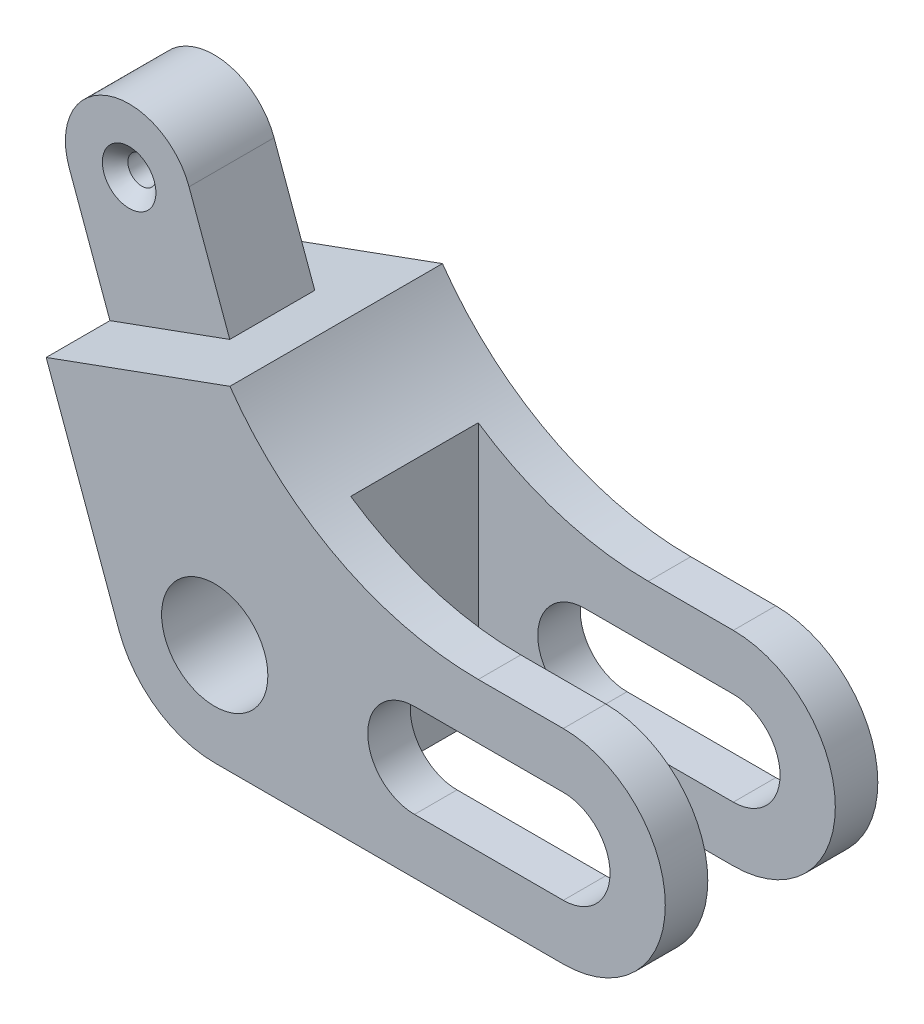
ISO-10303-21;
HEADER;
FILE_DESCRIPTION(('STEP AP214'),'2;1');
FILE_NAME('part.step','',(''),(''),'','','');
FILE_SCHEMA(('AUTOMOTIVE_DESIGN { 1 0 10303 214 1 1 1 1 }'));
ENDSEC;
DATA;
#1=APPLICATION_CONTEXT('core data for automotive mechanical design processes');
#2=APPLICATION_PROTOCOL_DEFINITION('international standard','automotive_design',2000,#1);
#3=PRODUCT_CONTEXT('',#1,'mechanical');
#4=PRODUCT('Part','Part','',(#3));
#5=PRODUCT_RELATED_PRODUCT_CATEGORY('part','',(#4));
#6=PRODUCT_DEFINITION_FORMATION('','',#4);
#7=PRODUCT_DEFINITION_CONTEXT('part definition',#1,'design');
#8=PRODUCT_DEFINITION('design','',#6,#7);
#9=PRODUCT_DEFINITION_SHAPE('','',#8);
#10=(LENGTH_UNIT() NAMED_UNIT(*) SI_UNIT(.MILLI.,.METRE.));
#11=(NAMED_UNIT(*) PLANE_ANGLE_UNIT() SI_UNIT($,.RADIAN.));
#12=(NAMED_UNIT(*) SI_UNIT($,.STERADIAN.) SOLID_ANGLE_UNIT());
#13=UNCERTAINTY_MEASURE_WITH_UNIT(LENGTH_MEASURE(1.E-05),#10,'distance_accuracy_value','');
#14=(GEOMETRIC_REPRESENTATION_CONTEXT(3) GLOBAL_UNCERTAINTY_ASSIGNED_CONTEXT((#13)) GLOBAL_UNIT_ASSIGNED_CONTEXT((#10,
#11,#12)) REPRESENTATION_CONTEXT('',''));
#15=CARTESIAN_POINT('',(0.,0.,0.));
#16=DIRECTION('',(0.,0.,1.));
#17=DIRECTION('',(1.,0.,0.));
#18=AXIS2_PLACEMENT_3D('',#15,#16,#17);
#19=CARTESIAN_POINT('',(82.,0.,25.));
#20=DIRECTION('',(0.,0.,-1.));
#21=DIRECTION('',(-1.,0.,0.));
#22=AXIS2_PLACEMENT_3D('',#19,#20,#21);
#23=CYLINDRICAL_SURFACE('',#22,24.);
#24=CARTESIAN_POINT('',(82.,0.,-15.));
#25=DIRECTION('',(0.,0.,1.));
#26=DIRECTION('',(1.,0.,0.));
#27=AXIS2_PLACEMENT_3D('',#24,#25,#26);
#28=CIRCLE('',#27,24.);
#29=CARTESIAN_POINT('',(82.,-24.,-15.));
#30=VERTEX_POINT('',#29);
#31=CARTESIAN_POINT('',(82.,24.,-15.));
#32=VERTEX_POINT('',#31);
#33=EDGE_CURVE('E236',#30,#32,#28,.T.);
#34=ORIENTED_EDGE('',*,*,#33,.F.);
#35=DIRECTION('',(0.,0.,-1.));
#36=VECTOR('',#35,1.);
#37=CARTESIAN_POINT('',(82.,-24.,25.));
#38=LINE('',#37,#36);
#39=CARTESIAN_POINT('',(82.,-24.,-25.));
#40=VERTEX_POINT('',#39);
#41=EDGE_CURVE('E225',#30,#40,#38,.T.);
#42=ORIENTED_EDGE('',*,*,#41,.T.);
#43=CARTESIAN_POINT('',(82.,0.,-25.));
#44=DIRECTION('',(0.,0.,1.));
#45=DIRECTION('',(1.,0.,0.));
#46=AXIS2_PLACEMENT_3D('',#43,#44,#45);
#47=CIRCLE('',#46,24.);
#48=CARTESIAN_POINT('',(82.,24.,-25.));
#49=VERTEX_POINT('',#48);
#50=EDGE_CURVE('E337',#40,#49,#47,.T.);
#51=ORIENTED_EDGE('',*,*,#50,.T.);
#52=DIRECTION('',(0.,0.,-1.));
#53=VECTOR('',#52,1.);
#54=CARTESIAN_POINT('',(82.,24.,25.));
#55=LINE('',#54,#53);
#56=EDGE_CURVE('E369',#32,#49,#55,.T.);
#57=ORIENTED_EDGE('',*,*,#56,.F.);
#58=EDGE_LOOP('',(#34,#42,#51,#57));
#59=FACE_BOUND('',#58,.T.);
#60=ADVANCED_FACE('F41',(#59),#23,.T.);
#61=CARTESIAN_POINT('',(82.,24.,25.));
#62=DIRECTION('',(0.,-1.,0.));
#63=DIRECTION('',(1.,0.,0.));
#64=AXIS2_PLACEMENT_3D('',#61,#62,#63);
#65=PLANE('',#64);
#66=DIRECTION('',(-1.,0.,0.));
#67=VECTOR('',#66,1.);
#68=CARTESIAN_POINT('',(82.,24.,-15.));
#69=LINE('',#68,#67);
#70=CARTESIAN_POINT('',(62.,24.,-15.));
#71=VERTEX_POINT('',#70);
#72=EDGE_CURVE('E60',#32,#71,#69,.T.);
#73=ORIENTED_EDGE('',*,*,#72,.F.);
#74=ORIENTED_EDGE('',*,*,#56,.T.);
#75=DIRECTION('',(-1.,0.,0.));
#76=VECTOR('',#75,1.);
#77=CARTESIAN_POINT('',(82.,24.,-25.));
#78=LINE('',#77,#76);
#79=CARTESIAN_POINT('',(62.,24.,-25.));
#80=VERTEX_POINT('',#79);
#81=EDGE_CURVE('E344',#49,#80,#78,.T.);
#82=ORIENTED_EDGE('',*,*,#81,.T.);
#83=DIRECTION('',(0.,0.,-1.));
#84=VECTOR('',#83,1.);
#85=CARTESIAN_POINT('',(62.,24.,25.));
#86=LINE('',#85,#84);
#87=EDGE_CURVE('E364',#71,#80,#86,.T.);
#88=ORIENTED_EDGE('',*,*,#87,.F.);
#89=EDGE_LOOP('',(#73,#74,#82,#88));
#90=FACE_BOUND('',#89,.T.);
#91=ADVANCED_FACE('F430',(#90),#65,.F.);
#92=CARTESIAN_POINT('',(47.,0.,25.));
#93=DIRECTION('',(0.,0.,-1.));
#94=DIRECTION('',(-1.,0.,0.));
#95=AXIS2_PLACEMENT_3D('',#92,#93,#94);
#96=CYLINDRICAL_SURFACE('',#95,11.);
#97=DIRECTION('',(0.,0.,-1.));
#98=VECTOR('',#97,1.);
#99=CARTESIAN_POINT('',(47.,11.,25.));
#100=LINE('',#99,#98);
#101=CARTESIAN_POINT('',(47.,11.,-15.));
#102=VERTEX_POINT('',#101);
#103=CARTESIAN_POINT('',(47.,11.,-25.));
#104=VERTEX_POINT('',#103);
#105=EDGE_CURVE('E287',#102,#104,#100,.T.);
#106=ORIENTED_EDGE('',*,*,#105,.F.);
#107=CARTESIAN_POINT('',(47.,0.,-15.));
#108=DIRECTION('',(0.,0.,1.));
#109=DIRECTION('',(1.,0.,0.));
#110=AXIS2_PLACEMENT_3D('',#107,#108,#109);
#111=CIRCLE('',#110,11.);
#112=CARTESIAN_POINT('',(47.,-11.,-15.));
#113=VERTEX_POINT('',#112);
#114=EDGE_CURVE('E62',#102,#113,#111,.T.);
#115=ORIENTED_EDGE('',*,*,#114,.T.);
#116=DIRECTION('',(0.,0.,-1.));
#117=VECTOR('',#116,1.);
#118=CARTESIAN_POINT('',(47.,-11.,25.));
#119=LINE('',#118,#117);
#120=CARTESIAN_POINT('',(47.,-11.,-25.));
#121=VERTEX_POINT('',#120);
#122=EDGE_CURVE('E306',#113,#121,#119,.T.);
#123=ORIENTED_EDGE('',*,*,#122,.T.);
#124=CARTESIAN_POINT('',(47.,0.,-25.));
#125=DIRECTION('',(0.,0.,1.));
#126=DIRECTION('',(1.,0.,0.));
#127=AXIS2_PLACEMENT_3D('',#124,#125,#126);
#128=CIRCLE('',#127,11.);
#129=EDGE_CURVE('E274',#104,#121,#128,.T.);
#130=ORIENTED_EDGE('',*,*,#129,.F.);
#131=EDGE_LOOP('',(#106,#115,#123,#130));
#132=FACE_BOUND('',#131,.T.);
#133=ADVANCED_FACE('F434',(#132),#96,.F.);
#134=CARTESIAN_POINT('',(47.,-11.,25.));
#135=DIRECTION('',(0.,1.,0.));
#136=DIRECTION('',(0.,0.,1.));
#137=AXIS2_PLACEMENT_3D('',#134,#135,#136);
#138=PLANE('',#137);
#139=ORIENTED_EDGE('',*,*,#122,.F.);
#140=DIRECTION('',(1.,0.,0.));
#141=VECTOR('',#140,1.);
#142=CARTESIAN_POINT('',(47.,-11.,-15.));
#143=LINE('',#142,#141);
#144=CARTESIAN_POINT('',(82.,-11.,-15.));
#145=VERTEX_POINT('',#144);
#146=EDGE_CURVE('E235',#113,#145,#143,.T.);
#147=ORIENTED_EDGE('',*,*,#146,.T.);
#148=DIRECTION('',(0.,0.,-1.));
#149=VECTOR('',#148,1.);
#150=CARTESIAN_POINT('',(82.,-11.,25.));
#151=LINE('',#150,#149);
#152=CARTESIAN_POINT('',(82.,-11.,-25.));
#153=VERTEX_POINT('',#152);
#154=EDGE_CURVE('E301',#145,#153,#151,.T.);
#155=ORIENTED_EDGE('',*,*,#154,.T.);
#156=DIRECTION('',(1.,0.,0.));
#157=VECTOR('',#156,1.);
#158=CARTESIAN_POINT('',(47.,-11.,-25.));
#159=LINE('',#158,#157);
#160=EDGE_CURVE('E286',#121,#153,#159,.T.);
#161=ORIENTED_EDGE('',*,*,#160,.F.);
#162=EDGE_LOOP('',(#139,#147,#155,#161));
#163=FACE_BOUND('',#162,.T.);
#164=ADVANCED_FACE('F421',(#163),#138,.T.);
#165=CARTESIAN_POINT('',(82.,0.,25.));
#166=DIRECTION('',(0.,0.,-1.));
#167=DIRECTION('',(-1.,0.,0.));
#168=AXIS2_PLACEMENT_3D('',#165,#166,#167);
#169=CYLINDRICAL_SURFACE('',#168,11.);
#170=ORIENTED_EDGE('',*,*,#154,.F.);
#171=CARTESIAN_POINT('',(82.,0.,-15.));
#172=DIRECTION('',(0.,0.,1.));
#173=DIRECTION('',(1.,0.,0.));
#174=AXIS2_PLACEMENT_3D('',#171,#172,#173);
#175=CIRCLE('',#174,11.);
#176=CARTESIAN_POINT('',(82.,11.,-15.));
#177=VERTEX_POINT('',#176);
#178=EDGE_CURVE('E230',#145,#177,#175,.T.);
#179=ORIENTED_EDGE('',*,*,#178,.T.);
#180=DIRECTION('',(0.,0.,-1.));
#181=VECTOR('',#180,1.);
#182=CARTESIAN_POINT('',(82.,11.,25.));
#183=LINE('',#182,#181);
#184=CARTESIAN_POINT('',(82.,11.,-25.));
#185=VERTEX_POINT('',#184);
#186=EDGE_CURVE('E297',#177,#185,#183,.T.);
#187=ORIENTED_EDGE('',*,*,#186,.T.);
#188=CARTESIAN_POINT('',(82.,0.,-25.));
#189=DIRECTION('',(0.,0.,1.));
#190=DIRECTION('',(-1.,0.,0.));
#191=AXIS2_PLACEMENT_3D('',#188,#189,#190);
#192=CIRCLE('',#191,11.);
#193=EDGE_CURVE('E295',#153,#185,#192,.T.);
#194=ORIENTED_EDGE('',*,*,#193,.F.);
#195=EDGE_LOOP('',(#170,#179,#187,#194));
#196=FACE_BOUND('',#195,.T.);
#197=ADVANCED_FACE('F411',(#196),#169,.F.);
#198=CARTESIAN_POINT('',(47.,11.,25.));
#199=DIRECTION('',(0.,-1.,0.));
#200=DIRECTION('',(0.,0.,-1.));
#201=AXIS2_PLACEMENT_3D('',#198,#199,#200);
#202=PLANE('',#201);
#203=ORIENTED_EDGE('',*,*,#186,.F.);
#204=DIRECTION('',(-1.,0.,0.));
#205=VECTOR('',#204,1.);
#206=CARTESIAN_POINT('',(47.,11.,-15.));
#207=LINE('',#206,#205);
#208=EDGE_CURVE('E384',#177,#102,#207,.T.);
#209=ORIENTED_EDGE('',*,*,#208,.T.);
#210=ORIENTED_EDGE('',*,*,#105,.T.);
#211=DIRECTION('',(-1.,0.,0.));
#212=VECTOR('',#211,1.);
#213=CARTESIAN_POINT('',(47.,11.,-25.));
#214=LINE('',#213,#212);
#215=EDGE_CURVE('E276',#185,#104,#214,.T.);
#216=ORIENTED_EDGE('',*,*,#215,.F.);
#217=EDGE_LOOP('',(#203,#209,#210,#216));
#218=FACE_BOUND('',#217,.T.);
#219=ADVANCED_FACE('F423',(#218),#202,.T.);
#220=CARTESIAN_POINT('',(-21.0394154546863,75.348145281255,25.));
#221=DIRECTION('',(-0.93969262078591,-0.342020143325663,0.));
#222=DIRECTION('',(0.342020143325663,-0.939692620785911,0.));
#223=AXIS2_PLACEMENT_3D('',#220,#221,#222);
#224=PLANE('',#223);
#225=DIRECTION('',(-0.342020143325663,0.93969262078591,0.));
#226=VECTOR('',#225,1.);
#227=CARTESIAN_POINT('',(-11.4628514415677,49.0367518992495,10.));
#228=LINE('',#227,#226);
#229=CARTESIAN_POINT('',(-11.4628514415677,49.0367518992495,10.));
#230=VERTEX_POINT('',#229);
#231=CARTESIAN_POINT('',(-21.0394154546863,75.348145281255,10.));
#232=VERTEX_POINT('',#231);
#233=EDGE_CURVE('E258',#230,#232,#228,.T.);
#234=ORIENTED_EDGE('',*,*,#233,.F.);
#235=DIRECTION('',(0.,0.,-1.));
#236=VECTOR('',#235,1.);
#237=CARTESIAN_POINT('',(-11.4628514415677,49.0367518992495,25.));
#238=LINE('',#237,#236);
#239=CARTESIAN_POINT('',(-11.4628514415677,49.0367518992495,-10.));
#240=VERTEX_POINT('',#239);
#241=EDGE_CURVE('E356',#230,#240,#238,.T.);
#242=ORIENTED_EDGE('',*,*,#241,.T.);
#243=DIRECTION('',(0.342020143325663,-0.93969262078591,0.));
#244=VECTOR('',#243,1.);
#245=CARTESIAN_POINT('',(-11.4628514415677,49.0367518992495,-10.));
#246=LINE('',#245,#244);
#247=CARTESIAN_POINT('',(-21.0394154546863,75.348145281255,-10.));
#248=VERTEX_POINT('',#247);
#249=EDGE_CURVE('E257',#248,#240,#246,.T.);
#250=ORIENTED_EDGE('',*,*,#249,.F.);
#251=DIRECTION('',(0.,0.,-1.));
#252=VECTOR('',#251,1.);
#253=CARTESIAN_POINT('',(-21.0394154546863,75.348145281255,25.));
#254=LINE('',#253,#252);
#255=EDGE_CURVE('E357',#232,#248,#254,.T.);
#256=ORIENTED_EDGE('',*,*,#255,.F.);
#257=EDGE_LOOP('',(#234,#242,#250,#256));
#258=FACE_BOUND('',#257,.T.);
#259=ADVANCED_FACE('F486',(#258),#224,.F.);
#260=CARTESIAN_POINT('',(0.,0.,25.));
#261=DIRECTION('',(0.,0.,1.));
#262=DIRECTION('',(1.,0.,0.));
#263=AXIS2_PLACEMENT_3D('',#260,#261,#262);
#264=PLANE('',#263);
#265=DIRECTION('',(-0.939692620785911,-0.342020143325663,0.));
#266=VECTOR('',#265,1.);
#267=CARTESIAN_POINT('',(3.57223049100689,54.5090741924601,25.));
#268=LINE('',#267,#266);
#269=CARTESIAN_POINT('',(3.5722304910069,54.5090741924601,25.));
#270=VERTEX_POINT('',#269);
#271=CARTESIAN_POINT('',(-39.653630065145,38.7761475994796,25.));
#272=VERTEX_POINT('',#271);
#273=EDGE_CURVE('E332',#270,#272,#268,.T.);
#274=ORIENTED_EDGE('',*,*,#273,.T.);
#275=DIRECTION('',(0.342020143325664,-0.93969262078591,0.));
#276=VECTOR('',#275,1.);
#277=CARTESIAN_POINT('',(-39.653630065145,38.7761475994796,25.));
#278=LINE('',#277,#276);
#279=CARTESIAN_POINT('',(-22.5526228988618,-8.20848343981591,25.));
#280=VERTEX_POINT('',#279);
#281=EDGE_CURVE('E334',#272,#280,#278,.T.);
#282=ORIENTED_EDGE('',*,*,#281,.T.);
#283=CARTESIAN_POINT('',(0.,0.,25.));
#284=DIRECTION('',(0.,0.,1.));
#285=DIRECTION('',(1.,0.,0.));
#286=AXIS2_PLACEMENT_3D('',#283,#284,#285);
#287=CIRCLE('',#286,24.);
#288=CARTESIAN_POINT('',(0.,-24.,25.));
#289=VERTEX_POINT('',#288);
#290=EDGE_CURVE('E317',#280,#289,#287,.T.);
#291=ORIENTED_EDGE('',*,*,#290,.T.);
#292=DIRECTION('',(1.,0.,0.));
#293=VECTOR('',#292,1.);
#294=CARTESIAN_POINT('',(0.,-24.,25.));
#295=LINE('',#294,#293);
#296=CARTESIAN_POINT('',(82.,-24.,25.));
#297=VERTEX_POINT('',#296);
#298=EDGE_CURVE('E325',#289,#297,#295,.T.);
#299=ORIENTED_EDGE('',*,*,#298,.T.);
#300=CARTESIAN_POINT('',(82.,0.,25.));
#301=DIRECTION('',(0.,0.,1.));
#302=DIRECTION('',(1.,0.,0.));
#303=AXIS2_PLACEMENT_3D('',#300,#301,#302);
#304=CIRCLE('',#303,24.);
#305=CARTESIAN_POINT('',(82.,24.,25.));
#306=VERTEX_POINT('',#305);
#307=EDGE_CURVE('E324',#297,#306,#304,.T.);
#308=ORIENTED_EDGE('',*,*,#307,.T.);
#309=DIRECTION('',(-1.,0.,0.));
#310=VECTOR('',#309,1.);
#311=CARTESIAN_POINT('',(82.,24.,25.));
#312=LINE('',#311,#310);
#313=CARTESIAN_POINT('',(62.,24.,25.));
#314=VERTEX_POINT('',#313);
#315=EDGE_CURVE('E330',#306,#314,#312,.T.);
#316=ORIENTED_EDGE('',*,*,#315,.T.);
#317=CARTESIAN_POINT('',(62.,95.2018960403388,25.));
#318=DIRECTION('',(0.,0.,-1.));
#319=DIRECTION('',(-1.,0.,0.));
#320=AXIS2_PLACEMENT_3D('',#317,#318,#319);
#321=CIRCLE('',#320,71.2018960403388);
#322=EDGE_CURVE('E328',#314,#270,#321,.T.);
#323=ORIENTED_EDGE('',*,*,#322,.T.);
#324=EDGE_LOOP('',(#274,#282,#291,#299,#308,#316,#323));
#325=FACE_BOUND('',#324,.T.);
#326=DIRECTION('',(1.,0.,0.));
#327=VECTOR('',#326,1.);
#328=CARTESIAN_POINT('',(47.,-11.,25.));
#329=LINE('',#328,#327);
#330=CARTESIAN_POINT('',(47.,-11.,25.));
#331=VERTEX_POINT('',#330);
#332=CARTESIAN_POINT('',(82.,-11.,25.));
#333=VERTEX_POINT('',#332);
#334=EDGE_CURVE('E279',#331,#333,#329,.T.);
#335=ORIENTED_EDGE('',*,*,#334,.F.);
#336=CARTESIAN_POINT('',(47.,0.,25.));
#337=DIRECTION('',(0.,0.,1.));
#338=DIRECTION('',(1.,0.,0.));
#339=AXIS2_PLACEMENT_3D('',#336,#337,#338);
#340=CIRCLE('',#339,11.);
#341=CARTESIAN_POINT('',(47.,11.,25.));
#342=VERTEX_POINT('',#341);
#343=EDGE_CURVE('E277',#342,#331,#340,.T.);
#344=ORIENTED_EDGE('',*,*,#343,.F.);
#345=DIRECTION('',(-1.,0.,0.));
#346=VECTOR('',#345,1.);
#347=CARTESIAN_POINT('',(47.,11.,25.));
#348=LINE('',#347,#346);
#349=CARTESIAN_POINT('',(82.,11.,25.));
#350=VERTEX_POINT('',#349);
#351=EDGE_CURVE('E283',#350,#342,#348,.T.);
#352=ORIENTED_EDGE('',*,*,#351,.F.);
#353=CARTESIAN_POINT('',(82.,0.,25.));
#354=DIRECTION('',(0.,0.,1.));
#355=DIRECTION('',(-1.,0.,0.));
#356=AXIS2_PLACEMENT_3D('',#353,#354,#355);
#357=CIRCLE('',#356,11.);
#358=EDGE_CURVE('E284',#333,#350,#357,.T.);
#359=ORIENTED_EDGE('',*,*,#358,.F.);
#360=EDGE_LOOP('',(#335,#344,#352,#359));
#361=FACE_BOUND('',#360,.T.);
#362=CARTESIAN_POINT('',(0.,0.,25.));
#363=DIRECTION('',(0.,0.,1.));
#364=DIRECTION('',(1.,0.,0.));
#365=AXIS2_PLACEMENT_3D('',#362,#363,#364);
#366=CIRCLE('',#365,12.5);
#367=CARTESIAN_POINT('',(12.5,0.,25.));
#368=VERTEX_POINT('',#367);
#369=EDGE_CURVE('E311',#368,#368,#366,.T.);
#370=ORIENTED_EDGE('',*,*,#369,.F.);
#371=EDGE_LOOP('',(#370));
#372=FACE_BOUND('',#371,.T.);
#373=ADVANCED_FACE('F403',(#325,#361,#372),#264,.T.);
#374=CARTESIAN_POINT('',(0.,0.,-25.));
#375=DIRECTION('',(0.,0.,1.));
#376=DIRECTION('',(1.,0.,0.));
#377=AXIS2_PLACEMENT_3D('',#374,#375,#376);
#378=PLANE('',#377);
#379=CARTESIAN_POINT('',(0.,0.,-25.));
#380=DIRECTION('',(0.,0.,1.));
#381=DIRECTION('',(1.,0.,0.));
#382=AXIS2_PLACEMENT_3D('',#379,#380,#381);
#383=CIRCLE('',#382,12.5);
#384=CARTESIAN_POINT('',(12.5,0.,-25.));
#385=VERTEX_POINT('',#384);
#386=EDGE_CURVE('E315',#385,#385,#383,.T.);
#387=ORIENTED_EDGE('',*,*,#386,.T.);
#388=EDGE_LOOP('',(#387));
#389=FACE_BOUND('',#388,.T.);
#390=DIRECTION('',(0.342020143325663,-0.93969262078591,0.));
#391=VECTOR('',#390,1.);
#392=CARTESIAN_POINT('',(-39.653630065145,38.7761475994796,-25.));
#393=LINE('',#392,#391);
#394=CARTESIAN_POINT('',(-39.653630065145,38.7761475994796,-25.));
#395=VERTEX_POINT('',#394);
#396=CARTESIAN_POINT('',(-22.5526228988618,-8.20848343981591,-25.));
#397=VERTEX_POINT('',#396);
#398=EDGE_CURVE('E323',#395,#397,#393,.T.);
#399=ORIENTED_EDGE('',*,*,#398,.F.);
#400=DIRECTION('',(-0.939692620785911,-0.342020143325663,0.));
#401=VECTOR('',#400,1.);
#402=CARTESIAN_POINT('',(3.57223049100689,54.5090741924601,-25.));
#403=LINE('',#402,#401);
#404=CARTESIAN_POINT('',(3.5722304910069,54.5090741924601,-25.));
#405=VERTEX_POINT('',#404);
#406=EDGE_CURVE('E346',#405,#395,#403,.T.);
#407=ORIENTED_EDGE('',*,*,#406,.F.);
#408=CARTESIAN_POINT('',(62.,95.2018960403388,-25.));
#409=DIRECTION('',(0.,0.,-1.));
#410=DIRECTION('',(-1.,0.,0.));
#411=AXIS2_PLACEMENT_3D('',#408,#409,#410);
#412=CIRCLE('',#411,71.2018960403388);
#413=EDGE_CURVE('E347',#80,#405,#412,.T.);
#414=ORIENTED_EDGE('',*,*,#413,.F.);
#415=ORIENTED_EDGE('',*,*,#81,.F.);
#416=ORIENTED_EDGE('',*,*,#50,.F.);
#417=DIRECTION('',(1.,0.,0.));
#418=VECTOR('',#417,1.);
#419=CARTESIAN_POINT('',(0.,-24.,-25.));
#420=LINE('',#419,#418);
#421=CARTESIAN_POINT('',(0.,-24.,-25.));
#422=VERTEX_POINT('',#421);
#423=EDGE_CURVE('E340',#422,#40,#420,.T.);
#424=ORIENTED_EDGE('',*,*,#423,.F.);
#425=CARTESIAN_POINT('',(0.,0.,-25.));
#426=DIRECTION('',(0.,0.,1.));
#427=DIRECTION('',(1.,0.,0.));
#428=AXIS2_PLACEMENT_3D('',#425,#426,#427);
#429=CIRCLE('',#428,24.);
#430=EDGE_CURVE('E316',#397,#422,#429,.T.);
#431=ORIENTED_EDGE('',*,*,#430,.F.);
#432=EDGE_LOOP('',(#399,#407,#414,#415,#416,#424,#431));
#433=FACE_BOUND('',#432,.T.);
#434=ORIENTED_EDGE('',*,*,#129,.T.);
#435=ORIENTED_EDGE('',*,*,#160,.T.);
#436=ORIENTED_EDGE('',*,*,#193,.T.);
#437=ORIENTED_EDGE('',*,*,#215,.T.);
#438=EDGE_LOOP('',(#434,#435,#436,#437));
#439=FACE_BOUND('',#438,.T.);
#440=ADVANCED_FACE('F469',(#389,#433,#439),#378,.F.);
#441=CARTESIAN_POINT('',(0.,0.,25.));
#442=DIRECTION('',(0.,0.,-1.));
#443=DIRECTION('',(-1.,0.,0.));
#444=AXIS2_PLACEMENT_3D('',#441,#442,#443);
#445=CYLINDRICAL_SURFACE('',#444,24.);
#446=ORIENTED_EDGE('',*,*,#430,.T.);
#447=DIRECTION('',(0.,0.,-1.));
#448=VECTOR('',#447,1.);
#449=CARTESIAN_POINT('',(0.,-24.,25.));
#450=LINE('',#449,#448);
#451=EDGE_CURVE('E376',#289,#422,#450,.T.);
#452=ORIENTED_EDGE('',*,*,#451,.F.);
#453=ORIENTED_EDGE('',*,*,#290,.F.);
#454=DIRECTION('',(0.,0.,-1.));
#455=VECTOR('',#454,1.);
#456=CARTESIAN_POINT('',(-22.5526228988618,-8.20848343981591,25.));
#457=LINE('',#456,#455);
#458=EDGE_CURVE('E333',#280,#397,#457,.T.);
#459=ORIENTED_EDGE('',*,*,#458,.T.);
#460=EDGE_LOOP('',(#446,#452,#453,#459));
#461=FACE_BOUND('',#460,.T.);
#462=ADVANCED_FACE('F43',(#461),#445,.T.);
#463=CARTESIAN_POINT('',(0.,-24.,25.));
#464=DIRECTION('',(0.,1.,0.));
#465=DIRECTION('',(0.,0.,1.));
#466=AXIS2_PLACEMENT_3D('',#463,#464,#465);
#467=PLANE('',#466);
#468=DIRECTION('',(0.,0.,-1.));
#469=VECTOR('',#468,1.);
#470=CARTESIAN_POINT('',(22.,-24.,15.));
#471=LINE('',#470,#469);
#472=CARTESIAN_POINT('',(22.,-24.,15.));
#473=VERTEX_POINT('',#472);
#474=CARTESIAN_POINT('',(22.,-24.,-15.));
#475=VERTEX_POINT('',#474);
#476=EDGE_CURVE('E205',#473,#475,#471,.T.);
#477=ORIENTED_EDGE('',*,*,#476,.F.);
#478=DIRECTION('',(1.,0.,0.));
#479=VECTOR('',#478,1.);
#480=CARTESIAN_POINT('',(22.,-24.,15.));
#481=LINE('',#480,#479);
#482=CARTESIAN_POINT('',(82.,-24.,15.));
#483=VERTEX_POINT('',#482);
#484=EDGE_CURVE('E224',#473,#483,#481,.T.);
#485=ORIENTED_EDGE('',*,*,#484,.T.);
#486=EDGE_CURVE('E373',#297,#483,#38,.T.);
#487=ORIENTED_EDGE('',*,*,#486,.F.);
#488=ORIENTED_EDGE('',*,*,#298,.F.);
#489=ORIENTED_EDGE('',*,*,#451,.T.);
#490=ORIENTED_EDGE('',*,*,#423,.T.);
#491=ORIENTED_EDGE('',*,*,#41,.F.);
#492=DIRECTION('',(1.,0.,0.));
#493=VECTOR('',#492,1.);
#494=CARTESIAN_POINT('',(22.,-24.,-15.));
#495=LINE('',#494,#493);
#496=EDGE_CURVE('E213',#475,#30,#495,.T.);
#497=ORIENTED_EDGE('',*,*,#496,.F.);
#498=EDGE_LOOP('',(#477,#485,#487,#488,#489,#490,#491,#497));
#499=FACE_BOUND('',#498,.T.);
#500=ADVANCED_FACE('F219',(#499),#467,.F.);
#501=ORIENTED_EDGE('',*,*,#486,.T.);
#502=CARTESIAN_POINT('',(82.,0.,15.));
#503=DIRECTION('',(0.,0.,1.));
#504=DIRECTION('',(1.,0.,0.));
#505=AXIS2_PLACEMENT_3D('',#502,#503,#504);
#506=CIRCLE('',#505,24.);
#507=CARTESIAN_POINT('',(82.,24.,15.));
#508=VERTEX_POINT('',#507);
#509=EDGE_CURVE('E252',#483,#508,#506,.T.);
#510=ORIENTED_EDGE('',*,*,#509,.T.);
#511=EDGE_CURVE('E367',#306,#508,#55,.T.);
#512=ORIENTED_EDGE('',*,*,#511,.F.);
#513=ORIENTED_EDGE('',*,*,#307,.F.);
#514=EDGE_LOOP('',(#501,#510,#512,#513));
#515=FACE_BOUND('',#514,.T.);
#516=ADVANCED_FACE('F429',(#515),#23,.T.);
#517=ORIENTED_EDGE('',*,*,#511,.T.);
#518=DIRECTION('',(-1.,0.,0.));
#519=VECTOR('',#518,1.);
#520=CARTESIAN_POINT('',(82.,24.,15.));
#521=LINE('',#520,#519);
#522=CARTESIAN_POINT('',(62.,24.,15.));
#523=VERTEX_POINT('',#522);
#524=EDGE_CURVE('E246',#508,#523,#521,.T.);
#525=ORIENTED_EDGE('',*,*,#524,.T.);
#526=EDGE_CURVE('E368',#314,#523,#86,.T.);
#527=ORIENTED_EDGE('',*,*,#526,.F.);
#528=ORIENTED_EDGE('',*,*,#315,.F.);
#529=EDGE_LOOP('',(#517,#525,#527,#528));
#530=FACE_BOUND('',#529,.T.);
#531=ADVANCED_FACE('F437',(#530),#65,.F.);
#532=CARTESIAN_POINT('',(62.,95.2018960403388,25.));
#533=DIRECTION('',(0.,0.,-1.));
#534=DIRECTION('',(-1.,0.,0.));
#535=AXIS2_PLACEMENT_3D('',#532,#533,#534);
#536=CYLINDRICAL_SURFACE('',#535,71.2018960403388);
#537=ORIENTED_EDGE('',*,*,#526,.T.);
#538=CARTESIAN_POINT('',(62.,95.2018960403388,15.));
#539=DIRECTION('',(0.,0.,1.));
#540=DIRECTION('',(1.,0.,0.));
#541=AXIS2_PLACEMENT_3D('',#538,#539,#540);
#542=CIRCLE('',#541,71.2018960403388);
#543=CARTESIAN_POINT('',(22.,36.2976517133023,15.));
#544=VERTEX_POINT('',#543);
#545=EDGE_CURVE('E247',#523,#544,#542,.F.);
#546=ORIENTED_EDGE('',*,*,#545,.T.);
#547=DIRECTION('',(0.,0.,-1.));
#548=VECTOR('',#547,1.);
#549=CARTESIAN_POINT('',(22.,36.2976517133023,25.));
#550=LINE('',#549,#548);
#551=CARTESIAN_POINT('',(22.,36.2976517133023,-15.));
#552=VERTEX_POINT('',#551);
#553=EDGE_CURVE('E11',#552,#544,#550,.F.);
#554=ORIENTED_EDGE('',*,*,#553,.F.);
#555=CARTESIAN_POINT('',(62.,95.2018960403388,-15.));
#556=DIRECTION('',(0.,0.,1.));
#557=DIRECTION('',(1.,0.,0.));
#558=AXIS2_PLACEMENT_3D('',#555,#556,#557);
#559=CIRCLE('',#558,71.2018960403388);
#560=EDGE_CURVE('E220',#71,#552,#559,.F.);
#561=ORIENTED_EDGE('',*,*,#560,.F.);
#562=ORIENTED_EDGE('',*,*,#87,.T.);
#563=ORIENTED_EDGE('',*,*,#413,.T.);
#564=DIRECTION('',(0.,0.,-1.));
#565=VECTOR('',#564,1.);
#566=CARTESIAN_POINT('',(3.5722304910069,54.5090741924601,25.));
#567=LINE('',#566,#565);
#568=EDGE_CURVE('E362',#270,#405,#567,.T.);
#569=ORIENTED_EDGE('',*,*,#568,.F.);
#570=ORIENTED_EDGE('',*,*,#322,.F.);
#571=EDGE_LOOP('',(#537,#546,#554,#561,#562,#563,#569,#570));
#572=FACE_BOUND('',#571,.T.);
#573=ADVANCED_FACE('F443',(#572),#536,.F.);
#574=CARTESIAN_POINT('',(3.57223049100689,54.5090741924601,25.));
#575=DIRECTION('',(0.342020143325663,-0.939692620785911,0.));
#576=DIRECTION('',(0.939692620785911,0.342020143325663,0.));
#577=AXIS2_PLACEMENT_3D('',#574,#575,#576);
#578=PLANE('',#577);
#579=ORIENTED_EDGE('',*,*,#406,.T.);
#580=DIRECTION('',(0.,0.,-1.));
#581=VECTOR('',#580,1.);
#582=CARTESIAN_POINT('',(-39.653630065145,38.7761475994797,25.));
#583=LINE('',#582,#581);
#584=CARTESIAN_POINT('',(-39.653630065145,38.7761475994796,-10.));
#585=VERTEX_POINT('',#584);
#586=EDGE_CURVE('E377',#585,#395,#583,.T.);
#587=ORIENTED_EDGE('',*,*,#586,.F.);
#588=DIRECTION('',(0.93969262078591,0.342020143325663,0.));
#589=VECTOR('',#588,1.);
#590=CARTESIAN_POINT('',(-58.4474824808632,31.9357447329663,-10.));
#591=LINE('',#590,#589);
#592=EDGE_CURVE('E254',#585,#240,#591,.T.);
#593=ORIENTED_EDGE('',*,*,#592,.T.);
#594=ORIENTED_EDGE('',*,*,#241,.F.);
#595=DIRECTION('',(0.93969262078591,0.342020143325663,0.));
#596=VECTOR('',#595,1.);
#597=CARTESIAN_POINT('',(-58.4474824808632,31.9357447329663,10.));
#598=LINE('',#597,#596);
#599=CARTESIAN_POINT('',(-39.653630065145,38.7761475994796,10.));
#600=VERTEX_POINT('',#599);
#601=EDGE_CURVE('E259',#600,#230,#598,.T.);
#602=ORIENTED_EDGE('',*,*,#601,.F.);
#603=DIRECTION('',(0.,0.,-1.));
#604=VECTOR('',#603,1.);
#605=CARTESIAN_POINT('',(-39.653630065145,38.7761475994796,25.));
#606=LINE('',#605,#604);
#607=EDGE_CURVE('E385',#272,#600,#606,.T.);
#608=ORIENTED_EDGE('',*,*,#607,.F.);
#609=ORIENTED_EDGE('',*,*,#273,.F.);
#610=ORIENTED_EDGE('',*,*,#568,.T.);
#611=EDGE_LOOP('',(#579,#587,#593,#594,#602,#608,#609,#610));
#612=FACE_BOUND('',#611,.T.);
#613=ADVANCED_FACE('F474',(#612),#578,.F.);
#614=CARTESIAN_POINT('',(-35.1348047664749,70.21784313137,25.));
#615=DIRECTION('',(0.,0.,-1.));
#616=DIRECTION('',(-1.,0.,0.));
#617=AXIS2_PLACEMENT_3D('',#614,#615,#616);
#618=CYLINDRICAL_SURFACE('',#617,15.);
#619=DIRECTION('',(0.,0.,-1.));
#620=VECTOR('',#619,1.);
#621=CARTESIAN_POINT('',(-49.2301940782636,65.0875409814851,25.));
#622=LINE('',#621,#620);
#623=CARTESIAN_POINT('',(-49.2301940782635,65.0875409814851,10.));
#624=VERTEX_POINT('',#623);
#625=CARTESIAN_POINT('',(-49.2301940782635,65.0875409814851,-10.));
#626=VERTEX_POINT('',#625);
#627=EDGE_CURVE('E355',#624,#626,#622,.T.);
#628=ORIENTED_EDGE('',*,*,#627,.F.);
#629=CARTESIAN_POINT('',(-35.1348047664749,70.21784313137,10.));
#630=DIRECTION('',(0.,0.,-1.));
#631=DIRECTION('',(0.,1.,0.));
#632=AXIS2_PLACEMENT_3D('',#629,#630,#631);
#633=CIRCLE('',#632,15.);
#634=EDGE_CURVE('E272',#624,#232,#633,.T.);
#635=ORIENTED_EDGE('',*,*,#634,.T.);
#636=ORIENTED_EDGE('',*,*,#255,.T.);
#637=CARTESIAN_POINT('',(-35.1348047664749,70.21784313137,-10.));
#638=DIRECTION('',(0.,0.,1.));
#639=DIRECTION('',(1.,0.,0.));
#640=AXIS2_PLACEMENT_3D('',#637,#638,#639);
#641=CIRCLE('',#640,15.);
#642=EDGE_CURVE('E268',#248,#626,#641,.T.);
#643=ORIENTED_EDGE('',*,*,#642,.T.);
#644=EDGE_LOOP('',(#628,#635,#636,#643));
#645=FACE_BOUND('',#644,.T.);
#646=ADVANCED_FACE('F495',(#645),#618,.T.);
#647=CARTESIAN_POINT('',(-39.653630065145,38.7761475994796,25.));
#648=DIRECTION('',(0.93969262078591,0.342020143325663,0.));
#649=DIRECTION('',(-0.342020143325663,0.939692620785911,0.));
#650=AXIS2_PLACEMENT_3D('',#647,#648,#649);
#651=PLANE('',#650);
#652=ORIENTED_EDGE('',*,*,#607,.T.);
#653=DIRECTION('',(-0.342020143325663,0.939692620785911,0.));
#654=VECTOR('',#653,1.);
#655=CARTESIAN_POINT('',(-39.653630065145,38.7761475994796,10.));
#656=LINE('',#655,#654);
#657=EDGE_CURVE('E269',#600,#624,#656,.T.);
#658=ORIENTED_EDGE('',*,*,#657,.T.);
#659=ORIENTED_EDGE('',*,*,#627,.T.);
#660=DIRECTION('',(0.342020143325663,-0.939692620785911,0.));
#661=VECTOR('',#660,1.);
#662=CARTESIAN_POINT('',(-39.653630065145,38.7761475994796,-10.));
#663=LINE('',#662,#661);
#664=EDGE_CURVE('E265',#626,#585,#663,.T.);
#665=ORIENTED_EDGE('',*,*,#664,.T.);
#666=ORIENTED_EDGE('',*,*,#586,.T.);
#667=ORIENTED_EDGE('',*,*,#398,.T.);
#668=ORIENTED_EDGE('',*,*,#458,.F.);
#669=ORIENTED_EDGE('',*,*,#281,.F.);
#670=EDGE_LOOP('',(#652,#658,#659,#665,#666,#667,#668,#669));
#671=FACE_BOUND('',#670,.T.);
#672=ADVANCED_FACE('F476',(#671),#651,.F.);
#673=CARTESIAN_POINT('',(0.,0.,25.));
#674=DIRECTION('',(0.,0.,-1.));
#675=DIRECTION('',(-1.,0.,0.));
#676=AXIS2_PLACEMENT_3D('',#673,#674,#675);
#677=CYLINDRICAL_SURFACE('',#676,12.5);
#678=ORIENTED_EDGE('',*,*,#369,.T.);
#679=EDGE_LOOP('',(#678));
#680=FACE_BOUND('',#679,.T.);
#681=ORIENTED_EDGE('',*,*,#386,.F.);
#682=EDGE_LOOP('',(#681));
#683=FACE_BOUND('',#682,.T.);
#684=ADVANCED_FACE('F499',(#680,#683),#677,.F.);
#685=CARTESIAN_POINT('',(47.,0.,15.));
#686=DIRECTION('',(0.,0.,1.));
#687=DIRECTION('',(1.,0.,0.));
#688=AXIS2_PLACEMENT_3D('',#685,#686,#687);
#689=CIRCLE('',#688,11.);
#690=CARTESIAN_POINT('',(47.,11.,15.));
#691=VERTEX_POINT('',#690);
#692=CARTESIAN_POINT('',(47.,-11.,15.));
#693=VERTEX_POINT('',#692);
#694=EDGE_CURVE('E243',#691,#693,#689,.T.);
#695=ORIENTED_EDGE('',*,*,#694,.F.);
#696=EDGE_CURVE('E296',#342,#691,#100,.T.);
#697=ORIENTED_EDGE('',*,*,#696,.F.);
#698=ORIENTED_EDGE('',*,*,#343,.T.);
#699=EDGE_CURVE('E310',#331,#693,#119,.T.);
#700=ORIENTED_EDGE('',*,*,#699,.T.);
#701=EDGE_LOOP('',(#695,#697,#698,#700));
#702=FACE_BOUND('',#701,.T.);
#703=ADVANCED_FACE('F400',(#702),#96,.F.);
#704=DIRECTION('',(1.,0.,0.));
#705=VECTOR('',#704,1.);
#706=CARTESIAN_POINT('',(47.,-11.,15.));
#707=LINE('',#706,#705);
#708=CARTESIAN_POINT('',(82.,-11.,15.));
#709=VERTEX_POINT('',#708);
#710=EDGE_CURVE('E241',#693,#709,#707,.T.);
#711=ORIENTED_EDGE('',*,*,#710,.F.);
#712=ORIENTED_EDGE('',*,*,#699,.F.);
#713=ORIENTED_EDGE('',*,*,#334,.T.);
#714=EDGE_CURVE('E303',#333,#709,#151,.T.);
#715=ORIENTED_EDGE('',*,*,#714,.T.);
#716=EDGE_LOOP('',(#711,#712,#713,#715));
#717=FACE_BOUND('',#716,.T.);
#718=ADVANCED_FACE('F410',(#717),#138,.T.);
#719=CARTESIAN_POINT('',(82.,0.,15.));
#720=DIRECTION('',(0.,0.,1.));
#721=DIRECTION('',(1.,0.,0.));
#722=AXIS2_PLACEMENT_3D('',#719,#720,#721);
#723=CIRCLE('',#722,11.);
#724=CARTESIAN_POINT('',(82.,11.,15.));
#725=VERTEX_POINT('',#724);
#726=EDGE_CURVE('E238',#709,#725,#723,.T.);
#727=ORIENTED_EDGE('',*,*,#726,.F.);
#728=ORIENTED_EDGE('',*,*,#714,.F.);
#729=ORIENTED_EDGE('',*,*,#358,.T.);
#730=EDGE_CURVE('E302',#350,#725,#183,.T.);
#731=ORIENTED_EDGE('',*,*,#730,.T.);
#732=EDGE_LOOP('',(#727,#728,#729,#731));
#733=FACE_BOUND('',#732,.T.);
#734=ADVANCED_FACE('F412',(#733),#169,.F.);
#735=DIRECTION('',(-1.,0.,0.));
#736=VECTOR('',#735,1.);
#737=CARTESIAN_POINT('',(47.,11.,15.));
#738=LINE('',#737,#736);
#739=EDGE_CURVE('E49',#725,#691,#738,.T.);
#740=ORIENTED_EDGE('',*,*,#739,.F.);
#741=ORIENTED_EDGE('',*,*,#730,.F.);
#742=ORIENTED_EDGE('',*,*,#351,.T.);
#743=ORIENTED_EDGE('',*,*,#696,.T.);
#744=EDGE_LOOP('',(#740,#741,#742,#743));
#745=FACE_BOUND('',#744,.T.);
#746=ADVANCED_FACE('F398',(#745),#202,.T.);
#747=CARTESIAN_POINT('',(-58.4474824808632,31.9357447329663,-10.));
#748=DIRECTION('',(0.,0.,1.));
#749=DIRECTION('',(1.,0.,0.));
#750=AXIS2_PLACEMENT_3D('',#747,#748,#749);
#751=PLANE('',#750);
#752=CARTESIAN_POINT('',(-35.1348047664749,70.21784313137,-10.));
#753=DIRECTION('',(0.,0.,1.));
#754=DIRECTION('',(1.,0.,0.));
#755=AXIS2_PLACEMENT_3D('',#752,#753,#754);
#756=CIRCLE('',#755,3.3);
#757=CARTESIAN_POINT('',(-31.8348047664749,70.21784313137,-10.));
#758=VERTEX_POINT('',#757);
#759=EDGE_CURVE('E44',#758,#758,#756,.T.);
#760=ORIENTED_EDGE('',*,*,#759,.T.);
#761=EDGE_LOOP('',(#760));
#762=FACE_BOUND('',#761,.T.);
#763=ORIENTED_EDGE('',*,*,#249,.T.);
#764=ORIENTED_EDGE('',*,*,#592,.F.);
#765=ORIENTED_EDGE('',*,*,#664,.F.);
#766=ORIENTED_EDGE('',*,*,#642,.F.);
#767=EDGE_LOOP('',(#763,#764,#765,#766));
#768=FACE_BOUND('',#767,.T.);
#769=ADVANCED_FACE('F420',(#762,#768),#751,.F.);
#770=CARTESIAN_POINT('',(-58.4474824808632,31.9357447329663,10.));
#771=DIRECTION('',(0.,0.,-1.));
#772=DIRECTION('',(0.,1.,0.));
#773=AXIS2_PLACEMENT_3D('',#770,#771,#772);
#774=PLANE('',#773);
#775=CARTESIAN_POINT('',(-35.1348047664749,70.21784313137,10.));
#776=DIRECTION('',(0.,0.,1.));
#777=DIRECTION('',(1.,0.,0.));
#778=AXIS2_PLACEMENT_3D('',#775,#776,#777);
#779=CIRCLE('',#778,6.3);
#780=CARTESIAN_POINT('',(-28.8348047664749,70.21784313137,10.));
#781=VERTEX_POINT('',#780);
#782=EDGE_CURVE('E659',#781,#781,#779,.T.);
#783=ORIENTED_EDGE('',*,*,#782,.F.);
#784=EDGE_LOOP('',(#783));
#785=FACE_BOUND('',#784,.T.);
#786=ORIENTED_EDGE('',*,*,#634,.F.);
#787=ORIENTED_EDGE('',*,*,#657,.F.);
#788=ORIENTED_EDGE('',*,*,#601,.T.);
#789=ORIENTED_EDGE('',*,*,#233,.T.);
#790=EDGE_LOOP('',(#786,#787,#788,#789));
#791=FACE_BOUND('',#790,.T.);
#792=ADVANCED_FACE('F488',(#785,#791),#774,.F.);
#793=CARTESIAN_POINT('',(22.,-24.,15.));
#794=DIRECTION('',(1.,0.,0.));
#795=DIRECTION('',(0.,1.,0.));
#796=AXIS2_PLACEMENT_3D('',#793,#794,#795);
#797=PLANE('',#796);
#798=ORIENTED_EDGE('',*,*,#553,.T.);
#799=DIRECTION('',(0.,1.,0.));
#800=VECTOR('',#799,1.);
#801=CARTESIAN_POINT('',(22.,-24.,15.));
#802=LINE('',#801,#800);
#803=EDGE_CURVE('E208',#473,#544,#802,.T.);
#804=ORIENTED_EDGE('',*,*,#803,.F.);
#805=ORIENTED_EDGE('',*,*,#476,.T.);
#806=DIRECTION('',(0.,1.,0.));
#807=VECTOR('',#806,1.);
#808=CARTESIAN_POINT('',(22.,-24.,-15.));
#809=LINE('',#808,#807);
#810=EDGE_CURVE('E202',#475,#552,#809,.T.);
#811=ORIENTED_EDGE('',*,*,#810,.T.);
#812=EDGE_LOOP('',(#798,#804,#805,#811));
#813=FACE_BOUND('',#812,.T.);
#814=ADVANCED_FACE('F204',(#813),#797,.T.);
#815=CARTESIAN_POINT('',(22.,-24.,15.));
#816=DIRECTION('',(0.,0.,1.));
#817=DIRECTION('',(1.,0.,0.));
#818=AXIS2_PLACEMENT_3D('',#815,#816,#817);
#819=PLANE('',#818);
#820=ORIENTED_EDGE('',*,*,#694,.T.);
#821=ORIENTED_EDGE('',*,*,#710,.T.);
#822=ORIENTED_EDGE('',*,*,#726,.T.);
#823=ORIENTED_EDGE('',*,*,#739,.T.);
#824=EDGE_LOOP('',(#820,#821,#822,#823));
#825=FACE_BOUND('',#824,.T.);
#826=ORIENTED_EDGE('',*,*,#484,.F.);
#827=ORIENTED_EDGE('',*,*,#803,.T.);
#828=ORIENTED_EDGE('',*,*,#545,.F.);
#829=ORIENTED_EDGE('',*,*,#524,.F.);
#830=ORIENTED_EDGE('',*,*,#509,.F.);
#831=EDGE_LOOP('',(#826,#827,#828,#829,#830));
#832=FACE_BOUND('',#831,.T.);
#833=ADVANCED_FACE('F388',(#825,#832),#819,.F.);
#834=CARTESIAN_POINT('',(22.,-24.,-15.));
#835=DIRECTION('',(0.,0.,1.));
#836=DIRECTION('',(1.,0.,0.));
#837=AXIS2_PLACEMENT_3D('',#834,#835,#836);
#838=PLANE('',#837);
#839=ORIENTED_EDGE('',*,*,#208,.F.);
#840=ORIENTED_EDGE('',*,*,#178,.F.);
#841=ORIENTED_EDGE('',*,*,#146,.F.);
#842=ORIENTED_EDGE('',*,*,#114,.F.);
#843=EDGE_LOOP('',(#839,#840,#841,#842));
#844=FACE_BOUND('',#843,.T.);
#845=ORIENTED_EDGE('',*,*,#33,.T.);
#846=ORIENTED_EDGE('',*,*,#72,.T.);
#847=ORIENTED_EDGE('',*,*,#560,.T.);
#848=ORIENTED_EDGE('',*,*,#810,.F.);
#849=ORIENTED_EDGE('',*,*,#496,.T.);
#850=EDGE_LOOP('',(#845,#846,#847,#848,#849));
#851=FACE_BOUND('',#850,.T.);
#852=ADVANCED_FACE('F214',(#844,#851),#838,.T.);
#853=CARTESIAN_POINT('',(-35.1348047664749,70.21784313137,10.));
#854=DIRECTION('',(0.,0.,1.));
#855=DIRECTION('',(1.,0.,0.));
#856=AXIS2_PLACEMENT_3D('',#853,#854,#855);
#857=CYLINDRICAL_SURFACE('',#856,3.3);
#858=CARTESIAN_POINT('',(-35.1348047664749,70.21784313137,7.));
#859=DIRECTION('',(0.,0.,1.));
#860=DIRECTION('',(1.,0.,0.));
#861=AXIS2_PLACEMENT_3D('',#858,#859,#860);
#862=CIRCLE('',#861,3.3);
#863=CARTESIAN_POINT('',(-31.8348047664749,70.21784313137,7.));
#864=VERTEX_POINT('',#863);
#865=EDGE_CURVE('E660',#864,#864,#862,.T.);
#866=ORIENTED_EDGE('',*,*,#865,.T.);
#867=EDGE_LOOP('',(#866));
#868=FACE_BOUND('',#867,.T.);
#869=ORIENTED_EDGE('',*,*,#759,.F.);
#870=EDGE_LOOP('',(#869));
#871=FACE_BOUND('',#870,.T.);
#872=ADVANCED_FACE('F634',(#868,#871),#857,.F.);
#873=CARTESIAN_POINT('',(-35.1348047664749,70.21784313137,10.));
#874=DIRECTION('',(0.,0.,1.));
#875=DIRECTION('',(1.,0.,0.));
#876=AXIS2_PLACEMENT_3D('',#873,#874,#875);
#877=CONICAL_SURFACE('',#876,6.3,0.785398163397449);
#878=ORIENTED_EDGE('',*,*,#865,.F.);
#879=EDGE_LOOP('',(#878));
#880=FACE_BOUND('',#879,.T.);
#881=ORIENTED_EDGE('',*,*,#782,.T.);
#882=EDGE_LOOP('',(#881));
#883=FACE_BOUND('',#882,.T.);
#884=ADVANCED_FACE('F643',(#880,#883),#877,.F.);
#885=CLOSED_SHELL('',(#60,#91,#133,#164,#197,#219,#259,#373,#440,#462,#500,#516,#531,#573,#613,
#646,#672,#684,#703,#718,#734,#746,#769,#792,#814,#833,#852,#872,#884));
#886=MANIFOLD_SOLID_BREP('B2',#885);
#887=ADVANCED_BREP_SHAPE_REPRESENTATION('',(#18,#886),#14);
#888=SHAPE_DEFINITION_REPRESENTATION(#9,#887);
ENDSEC;
END-ISO-10303-21;
